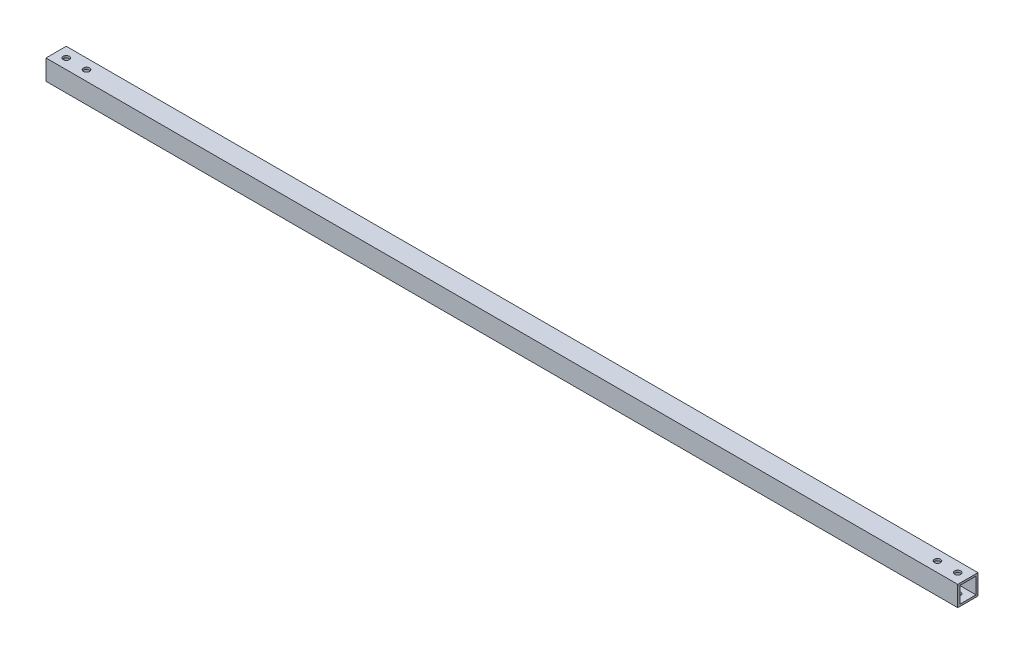
ISO-10303-21;
HEADER;
FILE_DESCRIPTION(('STEP AP214'),'2;1');
FILE_NAME('part.step','',(''),(''),'','','');
FILE_SCHEMA(('AUTOMOTIVE_DESIGN { 1 0 10303 214 1 1 1 1 }'));
ENDSEC;
DATA;
#1=APPLICATION_CONTEXT('core data for automotive mechanical design processes');
#2=APPLICATION_PROTOCOL_DEFINITION('international standard','automotive_design',2000,#1);
#3=PRODUCT_CONTEXT('',#1,'mechanical');
#4=PRODUCT('Part','Part','',(#3));
#5=PRODUCT_RELATED_PRODUCT_CATEGORY('part','',(#4));
#6=PRODUCT_DEFINITION_FORMATION('','',#4);
#7=PRODUCT_DEFINITION_CONTEXT('part definition',#1,'design');
#8=PRODUCT_DEFINITION('design','',#6,#7);
#9=PRODUCT_DEFINITION_SHAPE('','',#8);
#10=(LENGTH_UNIT() NAMED_UNIT(*) SI_UNIT(.MILLI.,.METRE.));
#11=(NAMED_UNIT(*) PLANE_ANGLE_UNIT() SI_UNIT($,.RADIAN.));
#12=(NAMED_UNIT(*) SI_UNIT($,.STERADIAN.) SOLID_ANGLE_UNIT());
#13=UNCERTAINTY_MEASURE_WITH_UNIT(LENGTH_MEASURE(1.E-05),#10,'distance_accuracy_value','');
#14=(GEOMETRIC_REPRESENTATION_CONTEXT(3) GLOBAL_UNCERTAINTY_ASSIGNED_CONTEXT((#13)) GLOBAL_UNIT_ASSIGNED_CONTEXT((#10,
#11,#12)) REPRESENTATION_CONTEXT('',''));
#15=CARTESIAN_POINT('',(0.,0.,0.));
#16=DIRECTION('',(0.,0.,1.));
#17=DIRECTION('',(1.,0.,0.));
#18=AXIS2_PLACEMENT_3D('',#15,#16,#17);
#19=CARTESIAN_POINT('',(450.,0.,0.));
#20=DIRECTION('',(1.,0.,0.));
#21=DIRECTION('',(0.,0.,-1.));
#22=AXIS2_PLACEMENT_3D('',#19,#20,#21);
#23=PLANE('',#22);
#24=DIRECTION('',(0.,-1.,0.));
#25=VECTOR('',#24,1.);
#26=CARTESIAN_POINT('',(450.,10.,10.));
#27=LINE('',#26,#25);
#28=CARTESIAN_POINT('',(450.,10.,10.));
#29=VERTEX_POINT('',#28);
#30=CARTESIAN_POINT('',(450.,-10.,10.));
#31=VERTEX_POINT('',#30);
#32=EDGE_CURVE('E138',#29,#31,#27,.T.);
#33=ORIENTED_EDGE('',*,*,#32,.T.);
#34=DIRECTION('',(0.,0.,-1.));
#35=VECTOR('',#34,1.);
#36=CARTESIAN_POINT('',(450.,-10.,10.));
#37=LINE('',#36,#35);
#38=CARTESIAN_POINT('',(450.,-10.,-10.));
#39=VERTEX_POINT('',#38);
#40=EDGE_CURVE('E141',#31,#39,#37,.T.);
#41=ORIENTED_EDGE('',*,*,#40,.T.);
#42=DIRECTION('',(0.,1.,0.));
#43=VECTOR('',#42,1.);
#44=CARTESIAN_POINT('',(450.,10.,-10.));
#45=LINE('',#44,#43);
#46=CARTESIAN_POINT('',(450.,10.,-10.));
#47=VERTEX_POINT('',#46);
#48=EDGE_CURVE('E144',#39,#47,#45,.T.);
#49=ORIENTED_EDGE('',*,*,#48,.T.);
#50=DIRECTION('',(0.,0.,1.));
#51=VECTOR('',#50,1.);
#52=CARTESIAN_POINT('',(450.,10.,10.));
#53=LINE('',#52,#51);
#54=EDGE_CURVE('E146',#47,#29,#53,.T.);
#55=ORIENTED_EDGE('',*,*,#54,.T.);
#56=EDGE_LOOP('',(#33,#41,#49,#55));
#57=FACE_BOUND('',#56,.T.);
#58=DIRECTION('',(0.,1.,0.));
#59=VECTOR('',#58,1.);
#60=CARTESIAN_POINT('',(450.,8.,-8.));
#61=LINE('',#60,#59);
#62=CARTESIAN_POINT('',(450.,-8.,-8.));
#63=VERTEX_POINT('',#62);
#64=CARTESIAN_POINT('',(450.,8.,-8.));
#65=VERTEX_POINT('',#64);
#66=EDGE_CURVE('E108',#63,#65,#61,.T.);
#67=ORIENTED_EDGE('',*,*,#66,.F.);
#68=DIRECTION('',(0.,0.,-1.));
#69=VECTOR('',#68,1.);
#70=CARTESIAN_POINT('',(450.,-8.,-8.));
#71=LINE('',#70,#69);
#72=CARTESIAN_POINT('',(450.,-8.,8.));
#73=VERTEX_POINT('',#72);
#74=EDGE_CURVE('E100',#73,#63,#71,.T.);
#75=ORIENTED_EDGE('',*,*,#74,.F.);
#76=DIRECTION('',(0.,-1.,0.));
#77=VECTOR('',#76,1.);
#78=CARTESIAN_POINT('',(450.,8.,8.));
#79=LINE('',#78,#77);
#80=CARTESIAN_POINT('',(450.,8.,8.));
#81=VERTEX_POINT('',#80);
#82=EDGE_CURVE('E122',#81,#73,#79,.T.);
#83=ORIENTED_EDGE('',*,*,#82,.F.);
#84=DIRECTION('',(0.,0.,1.));
#85=VECTOR('',#84,1.);
#86=CARTESIAN_POINT('',(450.,8.,-8.));
#87=LINE('',#86,#85);
#88=EDGE_CURVE('E120',#65,#81,#87,.T.);
#89=ORIENTED_EDGE('',*,*,#88,.F.);
#90=EDGE_LOOP('',(#67,#75,#83,#89));
#91=FACE_BOUND('',#90,.T.);
#92=ADVANCED_FACE('F33',(#57,#91),#23,.T.);
#93=CARTESIAN_POINT('',(-450.,0.,0.));
#94=DIRECTION('',(1.,0.,0.));
#95=DIRECTION('',(0.,0.,-1.));
#96=AXIS2_PLACEMENT_3D('',#93,#94,#95);
#97=PLANE('',#96);
#98=DIRECTION('',(0.,-1.,0.));
#99=VECTOR('',#98,1.);
#100=CARTESIAN_POINT('',(-450.,10.,10.));
#101=LINE('',#100,#99);
#102=CARTESIAN_POINT('',(-450.,10.,10.));
#103=VERTEX_POINT('',#102);
#104=CARTESIAN_POINT('',(-450.,-10.,10.));
#105=VERTEX_POINT('',#104);
#106=EDGE_CURVE('E116',#103,#105,#101,.T.);
#107=ORIENTED_EDGE('',*,*,#106,.F.);
#108=DIRECTION('',(0.,0.,1.));
#109=VECTOR('',#108,1.);
#110=CARTESIAN_POINT('',(-450.,10.,10.));
#111=LINE('',#110,#109);
#112=CARTESIAN_POINT('',(-450.,10.,-10.));
#113=VERTEX_POINT('',#112);
#114=EDGE_CURVE('E142',#113,#103,#111,.T.);
#115=ORIENTED_EDGE('',*,*,#114,.F.);
#116=DIRECTION('',(0.,1.,0.));
#117=VECTOR('',#116,1.);
#118=CARTESIAN_POINT('',(-450.,10.,-10.));
#119=LINE('',#118,#117);
#120=CARTESIAN_POINT('',(-450.,-10.,-10.));
#121=VERTEX_POINT('',#120);
#122=EDGE_CURVE('E153',#121,#113,#119,.T.);
#123=ORIENTED_EDGE('',*,*,#122,.F.);
#124=DIRECTION('',(0.,0.,-1.));
#125=VECTOR('',#124,1.);
#126=CARTESIAN_POINT('',(-450.,-10.,10.));
#127=LINE('',#126,#125);
#128=EDGE_CURVE('E151',#105,#121,#127,.T.);
#129=ORIENTED_EDGE('',*,*,#128,.F.);
#130=EDGE_LOOP('',(#107,#115,#123,#129));
#131=FACE_BOUND('',#130,.T.);
#132=DIRECTION('',(0.,0.,-1.));
#133=VECTOR('',#132,1.);
#134=CARTESIAN_POINT('',(-450.,-8.,-8.));
#135=LINE('',#134,#133);
#136=CARTESIAN_POINT('',(-450.,-8.,8.));
#137=VERTEX_POINT('',#136);
#138=CARTESIAN_POINT('',(-450.,-8.,-8.));
#139=VERTEX_POINT('',#138);
#140=EDGE_CURVE('E58',#137,#139,#135,.T.);
#141=ORIENTED_EDGE('',*,*,#140,.T.);
#142=DIRECTION('',(0.,1.,0.));
#143=VECTOR('',#142,1.);
#144=CARTESIAN_POINT('',(-450.,8.,-8.));
#145=LINE('',#144,#143);
#146=CARTESIAN_POINT('',(-450.,8.,-8.));
#147=VERTEX_POINT('',#146);
#148=EDGE_CURVE('E115',#139,#147,#145,.T.);
#149=ORIENTED_EDGE('',*,*,#148,.T.);
#150=DIRECTION('',(0.,0.,1.));
#151=VECTOR('',#150,1.);
#152=CARTESIAN_POINT('',(-450.,8.,-8.));
#153=LINE('',#152,#151);
#154=CARTESIAN_POINT('',(-450.,8.,8.));
#155=VERTEX_POINT('',#154);
#156=EDGE_CURVE('E130',#147,#155,#153,.T.);
#157=ORIENTED_EDGE('',*,*,#156,.T.);
#158=DIRECTION('',(0.,-1.,0.));
#159=VECTOR('',#158,1.);
#160=CARTESIAN_POINT('',(-450.,8.,8.));
#161=LINE('',#160,#159);
#162=EDGE_CURVE('E109',#155,#137,#161,.T.);
#163=ORIENTED_EDGE('',*,*,#162,.T.);
#164=EDGE_LOOP('',(#141,#149,#157,#163));
#165=FACE_BOUND('',#164,.T.);
#166=ADVANCED_FACE('F225',(#131,#165),#97,.F.);
#167=CARTESIAN_POINT('',(450.,10.,10.));
#168=DIRECTION('',(0.,0.,-1.));
#169=DIRECTION('',(-1.,0.,0.));
#170=AXIS2_PLACEMENT_3D('',#167,#168,#169);
#171=PLANE('',#170);
#172=ORIENTED_EDGE('',*,*,#106,.T.);
#173=DIRECTION('',(-1.,0.,0.));
#174=VECTOR('',#173,1.);
#175=CARTESIAN_POINT('',(450.,-10.,10.));
#176=LINE('',#175,#174);
#177=EDGE_CURVE('E11',#31,#105,#176,.T.);
#178=ORIENTED_EDGE('',*,*,#177,.F.);
#179=ORIENTED_EDGE('',*,*,#32,.F.);
#180=DIRECTION('',(-1.,0.,0.));
#181=VECTOR('',#180,1.);
#182=CARTESIAN_POINT('',(450.,10.,10.));
#183=LINE('',#182,#181);
#184=EDGE_CURVE('E148',#29,#103,#183,.T.);
#185=ORIENTED_EDGE('',*,*,#184,.T.);
#186=EDGE_LOOP('',(#172,#178,#179,#185));
#187=FACE_BOUND('',#186,.T.);
#188=ADVANCED_FACE('F35',(#187),#171,.F.);
#189=CARTESIAN_POINT('',(450.,-10.,10.));
#190=DIRECTION('',(0.,1.,0.));
#191=DIRECTION('',(0.,0.,1.));
#192=AXIS2_PLACEMENT_3D('',#189,#190,#191);
#193=PLANE('',#192);
#194=CARTESIAN_POINT('',(-420.,-10.,0.));
#195=DIRECTION('',(0.,1.,0.));
#196=DIRECTION('',(0.,0.,1.));
#197=AXIS2_PLACEMENT_3D('',#194,#195,#196);
#198=CIRCLE('',#197,2.99999999999999);
#199=CARTESIAN_POINT('',(-420.,-10.,2.99999999999999));
#200=VERTEX_POINT('',#199);
#201=EDGE_CURVE('E245',#200,#200,#198,.T.);
#202=ORIENTED_EDGE('',*,*,#201,.T.);
#203=EDGE_LOOP('',(#202));
#204=FACE_BOUND('',#203,.T.);
#205=CARTESIAN_POINT('',(-440.,-10.,0.));
#206=DIRECTION('',(0.,1.,0.));
#207=DIRECTION('',(0.,0.,1.));
#208=AXIS2_PLACEMENT_3D('',#205,#206,#207);
#209=CIRCLE('',#208,2.99999999999999);
#210=CARTESIAN_POINT('',(-440.,-10.,2.99999999999999));
#211=VERTEX_POINT('',#210);
#212=EDGE_CURVE('E174',#211,#211,#209,.T.);
#213=ORIENTED_EDGE('',*,*,#212,.T.);
#214=EDGE_LOOP('',(#213));
#215=FACE_BOUND('',#214,.T.);
#216=CARTESIAN_POINT('',(440.,-10.,0.));
#217=DIRECTION('',(0.,1.,0.));
#218=DIRECTION('',(0.,0.,1.));
#219=AXIS2_PLACEMENT_3D('',#216,#217,#218);
#220=CIRCLE('',#219,2.99999999999999);
#221=CARTESIAN_POINT('',(440.,-10.,2.99999999999999));
#222=VERTEX_POINT('',#221);
#223=EDGE_CURVE('E170',#222,#222,#220,.T.);
#224=ORIENTED_EDGE('',*,*,#223,.T.);
#225=EDGE_LOOP('',(#224));
#226=FACE_BOUND('',#225,.T.);
#227=CARTESIAN_POINT('',(420.,-10.,0.));
#228=DIRECTION('',(0.,1.,0.));
#229=DIRECTION('',(0.,0.,1.));
#230=AXIS2_PLACEMENT_3D('',#227,#228,#229);
#231=CIRCLE('',#230,2.99999999999999);
#232=CARTESIAN_POINT('',(420.,-10.,2.99999999999999));
#233=VERTEX_POINT('',#232);
#234=EDGE_CURVE('E166',#233,#233,#231,.T.);
#235=ORIENTED_EDGE('',*,*,#234,.T.);
#236=EDGE_LOOP('',(#235));
#237=FACE_BOUND('',#236,.T.);
#238=ORIENTED_EDGE('',*,*,#128,.T.);
#239=DIRECTION('',(-1.,0.,0.));
#240=VECTOR('',#239,1.);
#241=CARTESIAN_POINT('',(450.,-10.,-10.));
#242=LINE('',#241,#240);
#243=EDGE_CURVE('E42',#39,#121,#242,.T.);
#244=ORIENTED_EDGE('',*,*,#243,.F.);
#245=ORIENTED_EDGE('',*,*,#40,.F.);
#246=ORIENTED_EDGE('',*,*,#177,.T.);
#247=EDGE_LOOP('',(#238,#244,#245,#246));
#248=FACE_BOUND('',#247,.T.);
#249=ADVANCED_FACE('F234',(#204,#215,#226,#237,#248),#193,.F.);
#250=CARTESIAN_POINT('',(450.,10.,-10.));
#251=DIRECTION('',(0.,0.,1.));
#252=DIRECTION('',(1.,0.,0.));
#253=AXIS2_PLACEMENT_3D('',#250,#251,#252);
#254=PLANE('',#253);
#255=ORIENTED_EDGE('',*,*,#122,.T.);
#256=DIRECTION('',(-1.,0.,0.));
#257=VECTOR('',#256,1.);
#258=CARTESIAN_POINT('',(450.,10.,-10.));
#259=LINE('',#258,#257);
#260=EDGE_CURVE('E158',#47,#113,#259,.T.);
#261=ORIENTED_EDGE('',*,*,#260,.F.);
#262=ORIENTED_EDGE('',*,*,#48,.F.);
#263=ORIENTED_EDGE('',*,*,#243,.T.);
#264=EDGE_LOOP('',(#255,#261,#262,#263));
#265=FACE_BOUND('',#264,.T.);
#266=ADVANCED_FACE('F218',(#265),#254,.F.);
#267=CARTESIAN_POINT('',(450.,10.,10.));
#268=DIRECTION('',(0.,-1.,0.));
#269=DIRECTION('',(0.,0.,-1.));
#270=AXIS2_PLACEMENT_3D('',#267,#268,#269);
#271=PLANE('',#270);
#272=CARTESIAN_POINT('',(-420.,10.,0.));
#273=DIRECTION('',(0.,1.,0.));
#274=DIRECTION('',(0.,0.,1.));
#275=AXIS2_PLACEMENT_3D('',#272,#273,#274);
#276=CIRCLE('',#275,2.99999999999999);
#277=CARTESIAN_POINT('',(-420.,10.,2.99999999999999));
#278=VERTEX_POINT('',#277);
#279=EDGE_CURVE('E300',#278,#278,#276,.T.);
#280=ORIENTED_EDGE('',*,*,#279,.F.);
#281=EDGE_LOOP('',(#280));
#282=FACE_BOUND('',#281,.T.);
#283=CARTESIAN_POINT('',(-440.,10.,0.));
#284=DIRECTION('',(0.,1.,0.));
#285=DIRECTION('',(0.,0.,1.));
#286=AXIS2_PLACEMENT_3D('',#283,#284,#285);
#287=CIRCLE('',#286,2.99999999999999);
#288=CARTESIAN_POINT('',(-440.,10.,2.99999999999999));
#289=VERTEX_POINT('',#288);
#290=EDGE_CURVE('E181',#289,#289,#287,.T.);
#291=ORIENTED_EDGE('',*,*,#290,.F.);
#292=EDGE_LOOP('',(#291));
#293=FACE_BOUND('',#292,.T.);
#294=CARTESIAN_POINT('',(440.,10.,0.));
#295=DIRECTION('',(0.,1.,0.));
#296=DIRECTION('',(0.,0.,1.));
#297=AXIS2_PLACEMENT_3D('',#294,#295,#296);
#298=CIRCLE('',#297,2.99999999999999);
#299=CARTESIAN_POINT('',(440.,10.,2.99999999999999));
#300=VERTEX_POINT('',#299);
#301=EDGE_CURVE('E178',#300,#300,#298,.T.);
#302=ORIENTED_EDGE('',*,*,#301,.F.);
#303=EDGE_LOOP('',(#302));
#304=FACE_BOUND('',#303,.T.);
#305=CARTESIAN_POINT('',(420.,10.,0.));
#306=DIRECTION('',(0.,1.,0.));
#307=DIRECTION('',(0.,0.,1.));
#308=AXIS2_PLACEMENT_3D('',#305,#306,#307);
#309=CIRCLE('',#308,2.99999999999999);
#310=CARTESIAN_POINT('',(420.,10.,2.99999999999999));
#311=VERTEX_POINT('',#310);
#312=EDGE_CURVE('E197',#311,#311,#309,.T.);
#313=ORIENTED_EDGE('',*,*,#312,.F.);
#314=EDGE_LOOP('',(#313));
#315=FACE_BOUND('',#314,.T.);
#316=ORIENTED_EDGE('',*,*,#114,.T.);
#317=ORIENTED_EDGE('',*,*,#184,.F.);
#318=ORIENTED_EDGE('',*,*,#54,.F.);
#319=ORIENTED_EDGE('',*,*,#260,.T.);
#320=EDGE_LOOP('',(#316,#317,#318,#319));
#321=FACE_BOUND('',#320,.T.);
#322=ADVANCED_FACE('F208',(#282,#293,#304,#315,#321),#271,.F.);
#323=CARTESIAN_POINT('',(450.,-8.,-8.));
#324=DIRECTION('',(0.,1.,0.));
#325=DIRECTION('',(0.,0.,1.));
#326=AXIS2_PLACEMENT_3D('',#323,#324,#325);
#327=PLANE('',#326);
#328=CARTESIAN_POINT('',(-420.,-8.,0.));
#329=DIRECTION('',(0.,1.,0.));
#330=DIRECTION('',(0.,0.,1.));
#331=AXIS2_PLACEMENT_3D('',#328,#329,#330);
#332=CIRCLE('',#331,2.99999999999999);
#333=CARTESIAN_POINT('',(-420.,-8.,2.99999999999999));
#334=VERTEX_POINT('',#333);
#335=EDGE_CURVE('E186',#334,#334,#332,.T.);
#336=ORIENTED_EDGE('',*,*,#335,.F.);
#337=EDGE_LOOP('',(#336));
#338=FACE_BOUND('',#337,.T.);
#339=CARTESIAN_POINT('',(-440.,-8.,0.));
#340=DIRECTION('',(0.,1.,0.));
#341=DIRECTION('',(0.,0.,1.));
#342=AXIS2_PLACEMENT_3D('',#339,#340,#341);
#343=CIRCLE('',#342,2.99999999999999);
#344=CARTESIAN_POINT('',(-440.,-8.,2.99999999999999));
#345=VERTEX_POINT('',#344);
#346=EDGE_CURVE('E173',#345,#345,#343,.T.);
#347=ORIENTED_EDGE('',*,*,#346,.F.);
#348=EDGE_LOOP('',(#347));
#349=FACE_BOUND('',#348,.T.);
#350=CARTESIAN_POINT('',(440.,-8.,0.));
#351=DIRECTION('',(0.,1.,0.));
#352=DIRECTION('',(0.,0.,1.));
#353=AXIS2_PLACEMENT_3D('',#350,#351,#352);
#354=CIRCLE('',#353,2.99999999999999);
#355=CARTESIAN_POINT('',(440.,-8.,2.99999999999999));
#356=VERTEX_POINT('',#355);
#357=EDGE_CURVE('E169',#356,#356,#354,.T.);
#358=ORIENTED_EDGE('',*,*,#357,.F.);
#359=EDGE_LOOP('',(#358));
#360=FACE_BOUND('',#359,.T.);
#361=CARTESIAN_POINT('',(420.,-8.,0.));
#362=DIRECTION('',(0.,1.,0.));
#363=DIRECTION('',(0.,0.,1.));
#364=AXIS2_PLACEMENT_3D('',#361,#362,#363);
#365=CIRCLE('',#364,2.99999999999999);
#366=CARTESIAN_POINT('',(420.,-8.,2.99999999999999));
#367=VERTEX_POINT('',#366);
#368=EDGE_CURVE('E128',#367,#367,#365,.T.);
#369=ORIENTED_EDGE('',*,*,#368,.F.);
#370=EDGE_LOOP('',(#369));
#371=FACE_BOUND('',#370,.T.);
#372=ORIENTED_EDGE('',*,*,#140,.F.);
#373=DIRECTION('',(-1.,0.,0.));
#374=VECTOR('',#373,1.);
#375=CARTESIAN_POINT('',(450.,-8.,8.));
#376=LINE('',#375,#374);
#377=EDGE_CURVE('E104',#73,#137,#376,.T.);
#378=ORIENTED_EDGE('',*,*,#377,.F.);
#379=ORIENTED_EDGE('',*,*,#74,.T.);
#380=DIRECTION('',(-1.,0.,0.));
#381=VECTOR('',#380,1.);
#382=CARTESIAN_POINT('',(450.,-8.,-8.));
#383=LINE('',#382,#381);
#384=EDGE_CURVE('E103',#63,#139,#383,.T.);
#385=ORIENTED_EDGE('',*,*,#384,.T.);
#386=EDGE_LOOP('',(#372,#378,#379,#385));
#387=FACE_BOUND('',#386,.T.);
#388=ADVANCED_FACE('F102',(#338,#349,#360,#371,#387),#327,.T.);
#389=CARTESIAN_POINT('',(450.,8.,-8.));
#390=DIRECTION('',(0.,0.,1.));
#391=DIRECTION('',(1.,0.,0.));
#392=AXIS2_PLACEMENT_3D('',#389,#390,#391);
#393=PLANE('',#392);
#394=ORIENTED_EDGE('',*,*,#148,.F.);
#395=ORIENTED_EDGE('',*,*,#384,.F.);
#396=ORIENTED_EDGE('',*,*,#66,.T.);
#397=DIRECTION('',(-1.,0.,0.));
#398=VECTOR('',#397,1.);
#399=CARTESIAN_POINT('',(450.,8.,-8.));
#400=LINE('',#399,#398);
#401=EDGE_CURVE('E117',#65,#147,#400,.T.);
#402=ORIENTED_EDGE('',*,*,#401,.T.);
#403=EDGE_LOOP('',(#394,#395,#396,#402));
#404=FACE_BOUND('',#403,.T.);
#405=ADVANCED_FACE('F112',(#404),#393,.T.);
#406=CARTESIAN_POINT('',(450.,8.,-8.));
#407=DIRECTION('',(0.,-1.,0.));
#408=DIRECTION('',(0.,0.,-1.));
#409=AXIS2_PLACEMENT_3D('',#406,#407,#408);
#410=PLANE('',#409);
#411=CARTESIAN_POINT('',(-420.,8.,0.));
#412=DIRECTION('',(0.,-1.,0.));
#413=DIRECTION('',(0.,0.,-1.));
#414=AXIS2_PLACEMENT_3D('',#411,#412,#413);
#415=CIRCLE('',#414,2.99999999999999);
#416=CARTESIAN_POINT('',(-420.,8.,-2.99999999999999));
#417=VERTEX_POINT('',#416);
#418=EDGE_CURVE('E37',#417,#417,#415,.T.);
#419=ORIENTED_EDGE('',*,*,#418,.F.);
#420=EDGE_LOOP('',(#419));
#421=FACE_BOUND('',#420,.T.);
#422=CARTESIAN_POINT('',(-440.,8.,0.));
#423=DIRECTION('',(0.,-1.,0.));
#424=DIRECTION('',(0.,0.,-1.));
#425=AXIS2_PLACEMENT_3D('',#422,#423,#424);
#426=CIRCLE('',#425,2.99999999999999);
#427=CARTESIAN_POINT('',(-440.,8.,-2.99999999999999));
#428=VERTEX_POINT('',#427);
#429=EDGE_CURVE('E171',#428,#428,#426,.T.);
#430=ORIENTED_EDGE('',*,*,#429,.F.);
#431=EDGE_LOOP('',(#430));
#432=FACE_BOUND('',#431,.T.);
#433=CARTESIAN_POINT('',(440.,8.,0.));
#434=DIRECTION('',(0.,-1.,0.));
#435=DIRECTION('',(0.,0.,-1.));
#436=AXIS2_PLACEMENT_3D('',#433,#434,#435);
#437=CIRCLE('',#436,2.99999999999999);
#438=CARTESIAN_POINT('',(440.,8.,-2.99999999999999));
#439=VERTEX_POINT('',#438);
#440=EDGE_CURVE('E167',#439,#439,#437,.T.);
#441=ORIENTED_EDGE('',*,*,#440,.F.);
#442=EDGE_LOOP('',(#441));
#443=FACE_BOUND('',#442,.T.);
#444=CARTESIAN_POINT('',(420.,8.,0.));
#445=DIRECTION('',(0.,-1.,0.));
#446=DIRECTION('',(0.,0.,-1.));
#447=AXIS2_PLACEMENT_3D('',#444,#445,#446);
#448=CIRCLE('',#447,2.99999999999999);
#449=CARTESIAN_POINT('',(420.,8.,-2.99999999999999));
#450=VERTEX_POINT('',#449);
#451=EDGE_CURVE('E163',#450,#450,#448,.T.);
#452=ORIENTED_EDGE('',*,*,#451,.F.);
#453=EDGE_LOOP('',(#452));
#454=FACE_BOUND('',#453,.T.);
#455=ORIENTED_EDGE('',*,*,#156,.F.);
#456=ORIENTED_EDGE('',*,*,#401,.F.);
#457=ORIENTED_EDGE('',*,*,#88,.T.);
#458=DIRECTION('',(-1.,0.,0.));
#459=VECTOR('',#458,1.);
#460=CARTESIAN_POINT('',(450.,8.,8.));
#461=LINE('',#460,#459);
#462=EDGE_CURVE('E50',#81,#155,#461,.T.);
#463=ORIENTED_EDGE('',*,*,#462,.T.);
#464=EDGE_LOOP('',(#455,#456,#457,#463));
#465=FACE_BOUND('',#464,.T.);
#466=ADVANCED_FACE('F216',(#421,#432,#443,#454,#465),#410,.T.);
#467=CARTESIAN_POINT('',(450.,8.,8.));
#468=DIRECTION('',(0.,0.,-1.));
#469=DIRECTION('',(-1.,0.,0.));
#470=AXIS2_PLACEMENT_3D('',#467,#468,#469);
#471=PLANE('',#470);
#472=ORIENTED_EDGE('',*,*,#162,.F.);
#473=ORIENTED_EDGE('',*,*,#462,.F.);
#474=ORIENTED_EDGE('',*,*,#82,.T.);
#475=ORIENTED_EDGE('',*,*,#377,.T.);
#476=EDGE_LOOP('',(#472,#473,#474,#475));
#477=FACE_BOUND('',#476,.T.);
#478=ADVANCED_FACE('F264',(#477),#471,.T.);
#479=CARTESIAN_POINT('',(420.,-10.,0.));
#480=DIRECTION('',(0.,1.,0.));
#481=DIRECTION('',(0.,0.,1.));
#482=AXIS2_PLACEMENT_3D('',#479,#480,#481);
#483=CYLINDRICAL_SURFACE('',#482,2.99999999999999);
#484=ORIENTED_EDGE('',*,*,#451,.T.);
#485=EDGE_LOOP('',(#484));
#486=FACE_BOUND('',#485,.T.);
#487=ORIENTED_EDGE('',*,*,#312,.T.);
#488=EDGE_LOOP('',(#487));
#489=FACE_BOUND('',#488,.T.);
#490=ADVANCED_FACE('F266',(#486,#489),#483,.F.);
#491=ORIENTED_EDGE('',*,*,#368,.T.);
#492=EDGE_LOOP('',(#491));
#493=FACE_BOUND('',#492,.T.);
#494=ORIENTED_EDGE('',*,*,#234,.F.);
#495=EDGE_LOOP('',(#494));
#496=FACE_BOUND('',#495,.T.);
#497=ADVANCED_FACE('F204',(#493,#496),#483,.F.);
#498=CARTESIAN_POINT('',(440.,-10.,0.));
#499=DIRECTION('',(0.,1.,0.));
#500=DIRECTION('',(0.,0.,1.));
#501=AXIS2_PLACEMENT_3D('',#498,#499,#500);
#502=CYLINDRICAL_SURFACE('',#501,2.99999999999999);
#503=ORIENTED_EDGE('',*,*,#440,.T.);
#504=EDGE_LOOP('',(#503));
#505=FACE_BOUND('',#504,.T.);
#506=ORIENTED_EDGE('',*,*,#301,.T.);
#507=EDGE_LOOP('',(#506));
#508=FACE_BOUND('',#507,.T.);
#509=ADVANCED_FACE('F276',(#505,#508),#502,.F.);
#510=ORIENTED_EDGE('',*,*,#357,.T.);
#511=EDGE_LOOP('',(#510));
#512=FACE_BOUND('',#511,.T.);
#513=ORIENTED_EDGE('',*,*,#223,.F.);
#514=EDGE_LOOP('',(#513));
#515=FACE_BOUND('',#514,.T.);
#516=ADVANCED_FACE('F279',(#512,#515),#502,.F.);
#517=CARTESIAN_POINT('',(-440.,-10.,0.));
#518=DIRECTION('',(0.,1.,0.));
#519=DIRECTION('',(0.,0.,1.));
#520=AXIS2_PLACEMENT_3D('',#517,#518,#519);
#521=CYLINDRICAL_SURFACE('',#520,2.99999999999999);
#522=ORIENTED_EDGE('',*,*,#429,.T.);
#523=EDGE_LOOP('',(#522));
#524=FACE_BOUND('',#523,.T.);
#525=ORIENTED_EDGE('',*,*,#290,.T.);
#526=EDGE_LOOP('',(#525));
#527=FACE_BOUND('',#526,.T.);
#528=ADVANCED_FACE('F281',(#524,#527),#521,.F.);
#529=ORIENTED_EDGE('',*,*,#346,.T.);
#530=EDGE_LOOP('',(#529));
#531=FACE_BOUND('',#530,.T.);
#532=ORIENTED_EDGE('',*,*,#212,.F.);
#533=EDGE_LOOP('',(#532));
#534=FACE_BOUND('',#533,.T.);
#535=ADVANCED_FACE('F284',(#531,#534),#521,.F.);
#536=CARTESIAN_POINT('',(-420.,-10.,0.));
#537=DIRECTION('',(0.,1.,0.));
#538=DIRECTION('',(0.,0.,1.));
#539=AXIS2_PLACEMENT_3D('',#536,#537,#538);
#540=CYLINDRICAL_SURFACE('',#539,2.99999999999999);
#541=ORIENTED_EDGE('',*,*,#418,.T.);
#542=EDGE_LOOP('',(#541));
#543=FACE_BOUND('',#542,.T.);
#544=ORIENTED_EDGE('',*,*,#279,.T.);
#545=EDGE_LOOP('',(#544));
#546=FACE_BOUND('',#545,.T.);
#547=ADVANCED_FACE('F285',(#543,#546),#540,.F.);
#548=ORIENTED_EDGE('',*,*,#335,.T.);
#549=EDGE_LOOP('',(#548));
#550=FACE_BOUND('',#549,.T.);
#551=ORIENTED_EDGE('',*,*,#201,.F.);
#552=EDGE_LOOP('',(#551));
#553=FACE_BOUND('',#552,.T.);
#554=ADVANCED_FACE('F287',(#550,#553),#540,.F.);
#555=CLOSED_SHELL('',(#92,#166,#188,#249,#266,#322,#388,#405,#466,#478,#490,#497,#509,#516,#528,
#535,#547,#554));
#556=MANIFOLD_SOLID_BREP('B2',#555);
#557=ADVANCED_BREP_SHAPE_REPRESENTATION('',(#18,#556),#14);
#558=SHAPE_DEFINITION_REPRESENTATION(#9,#557);
ENDSEC;
END-ISO-10303-21;
